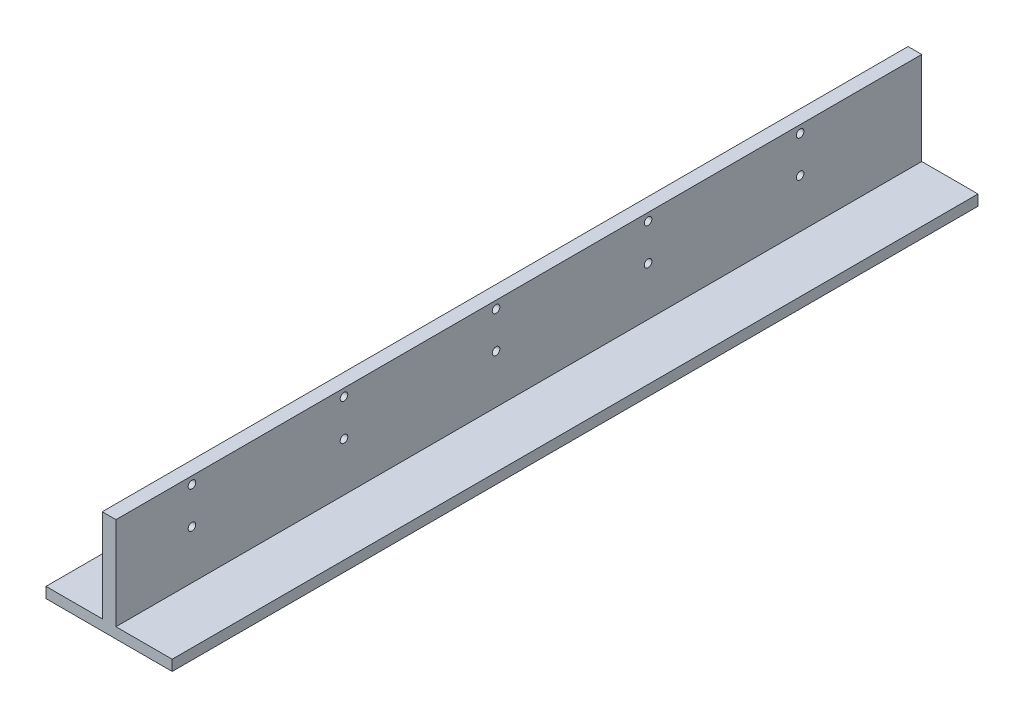
ISO-10303-21;
HEADER;
FILE_DESCRIPTION(('STEP AP214'),'2;1');
FILE_NAME('part.step','',(''),(''),'','','');
FILE_SCHEMA(('AUTOMOTIVE_DESIGN { 1 0 10303 214 1 1 1 1 }'));
ENDSEC;
DATA;
#1=APPLICATION_CONTEXT('core data for automotive mechanical design processes');
#2=APPLICATION_PROTOCOL_DEFINITION('international standard','automotive_design',2000,#1);
#3=PRODUCT_CONTEXT('',#1,'mechanical');
#4=PRODUCT('Part','Part','',(#3));
#5=PRODUCT_RELATED_PRODUCT_CATEGORY('part','',(#4));
#6=PRODUCT_DEFINITION_FORMATION('','',#4);
#7=PRODUCT_DEFINITION_CONTEXT('part definition',#1,'design');
#8=PRODUCT_DEFINITION('design','',#6,#7);
#9=PRODUCT_DEFINITION_SHAPE('','',#8);
#10=(LENGTH_UNIT() NAMED_UNIT(*) SI_UNIT(.MILLI.,.METRE.));
#11=(NAMED_UNIT(*) PLANE_ANGLE_UNIT() SI_UNIT($,.RADIAN.));
#12=(NAMED_UNIT(*) SI_UNIT($,.STERADIAN.) SOLID_ANGLE_UNIT());
#13=UNCERTAINTY_MEASURE_WITH_UNIT(LENGTH_MEASURE(1.E-05),#10,'distance_accuracy_value','');
#14=(GEOMETRIC_REPRESENTATION_CONTEXT(3) GLOBAL_UNCERTAINTY_ASSIGNED_CONTEXT((#13)) GLOBAL_UNIT_ASSIGNED_CONTEXT((#10,
#11,#12)) REPRESENTATION_CONTEXT('',''));
#15=CARTESIAN_POINT('',(0.,0.,0.));
#16=DIRECTION('',(0.,0.,1.));
#17=DIRECTION('',(1.,0.,0.));
#18=AXIS2_PLACEMENT_3D('',#15,#16,#17);
#19=CARTESIAN_POINT('',(0.,7.,530.));
#20=DIRECTION('',(1.,0.,0.));
#21=DIRECTION('',(0.,0.,-1.));
#22=AXIS2_PLACEMENT_3D('',#19,#20,#21);
#23=PLANE('',#22);
#24=DIRECTION('',(0.,-1.,0.));
#25=VECTOR('',#24,1.);
#26=CARTESIAN_POINT('',(0.,7.,0.));
#27=LINE('',#26,#25);
#28=CARTESIAN_POINT('',(0.,7.,0.));
#29=VERTEX_POINT('',#28);
#30=CARTESIAN_POINT('',(0.,0.,0.));
#31=VERTEX_POINT('',#30);
#32=EDGE_CURVE('E128',#29,#31,#27,.T.);
#33=ORIENTED_EDGE('',*,*,#32,.T.);
#34=DIRECTION('',(0.,0.,-1.));
#35=VECTOR('',#34,1.);
#36=CARTESIAN_POINT('',(0.,0.,530.));
#37=LINE('',#36,#35);
#38=CARTESIAN_POINT('',(0.,0.,530.));
#39=VERTEX_POINT('',#38);
#40=EDGE_CURVE('E11',#39,#31,#37,.T.);
#41=ORIENTED_EDGE('',*,*,#40,.F.);
#42=DIRECTION('',(0.,-1.,0.));
#43=VECTOR('',#42,1.);
#44=CARTESIAN_POINT('',(0.,7.,530.));
#45=LINE('',#44,#43);
#46=CARTESIAN_POINT('',(0.,7.,530.));
#47=VERTEX_POINT('',#46);
#48=EDGE_CURVE('E143',#47,#39,#45,.T.);
#49=ORIENTED_EDGE('',*,*,#48,.F.);
#50=DIRECTION('',(0.,0.,-1.));
#51=VECTOR('',#50,1.);
#52=CARTESIAN_POINT('',(0.,7.,530.));
#53=LINE('',#52,#51);
#54=EDGE_CURVE('E124',#47,#29,#53,.T.);
#55=ORIENTED_EDGE('',*,*,#54,.T.);
#56=EDGE_LOOP('',(#33,#41,#49,#55));
#57=FACE_BOUND('',#56,.T.);
#58=ADVANCED_FACE('F32',(#57),#23,.F.);
#59=CARTESIAN_POINT('',(0.,0.,530.));
#60=DIRECTION('',(0.,1.,0.));
#61=DIRECTION('',(0.,0.,1.));
#62=AXIS2_PLACEMENT_3D('',#59,#60,#61);
#63=PLANE('',#62);
#64=DIRECTION('',(1.,0.,0.));
#65=VECTOR('',#64,1.);
#66=CARTESIAN_POINT('',(0.,0.,0.));
#67=LINE('',#66,#65);
#68=CARTESIAN_POINT('',(83.,0.,0.));
#69=VERTEX_POINT('',#68);
#70=EDGE_CURVE('E131',#31,#69,#67,.T.);
#71=ORIENTED_EDGE('',*,*,#70,.T.);
#72=DIRECTION('',(0.,0.,-1.));
#73=VECTOR('',#72,1.);
#74=CARTESIAN_POINT('',(83.,0.,530.));
#75=LINE('',#74,#73);
#76=CARTESIAN_POINT('',(83.,0.,530.));
#77=VERTEX_POINT('',#76);
#78=EDGE_CURVE('E40',#77,#69,#75,.T.);
#79=ORIENTED_EDGE('',*,*,#78,.F.);
#80=DIRECTION('',(1.,0.,0.));
#81=VECTOR('',#80,1.);
#82=CARTESIAN_POINT('',(0.,0.,530.));
#83=LINE('',#82,#81);
#84=EDGE_CURVE('E91',#39,#77,#83,.T.);
#85=ORIENTED_EDGE('',*,*,#84,.F.);
#86=ORIENTED_EDGE('',*,*,#40,.T.);
#87=EDGE_LOOP('',(#71,#79,#85,#86));
#88=FACE_BOUND('',#87,.T.);
#89=ADVANCED_FACE('F283',(#88),#63,.F.);
#90=CARTESIAN_POINT('',(83.,0.,530.));
#91=DIRECTION('',(-1.,0.,0.));
#92=DIRECTION('',(0.,0.,1.));
#93=AXIS2_PLACEMENT_3D('',#90,#91,#92);
#94=PLANE('',#93);
#95=DIRECTION('',(0.,1.,0.));
#96=VECTOR('',#95,1.);
#97=CARTESIAN_POINT('',(83.,0.,0.));
#98=LINE('',#97,#96);
#99=CARTESIAN_POINT('',(83.,7.,0.));
#100=VERTEX_POINT('',#99);
#101=EDGE_CURVE('E134',#69,#100,#98,.T.);
#102=ORIENTED_EDGE('',*,*,#101,.T.);
#103=DIRECTION('',(0.,0.,-1.));
#104=VECTOR('',#103,1.);
#105=CARTESIAN_POINT('',(83.,7.,530.));
#106=LINE('',#105,#104);
#107=CARTESIAN_POINT('',(83.,7.,530.));
#108=VERTEX_POINT('',#107);
#109=EDGE_CURVE('E150',#108,#100,#106,.T.);
#110=ORIENTED_EDGE('',*,*,#109,.F.);
#111=DIRECTION('',(0.,1.,0.));
#112=VECTOR('',#111,1.);
#113=CARTESIAN_POINT('',(83.,0.,530.));
#114=LINE('',#113,#112);
#115=EDGE_CURVE('E158',#77,#108,#114,.T.);
#116=ORIENTED_EDGE('',*,*,#115,.F.);
#117=ORIENTED_EDGE('',*,*,#78,.T.);
#118=EDGE_LOOP('',(#102,#110,#116,#117));
#119=FACE_BOUND('',#118,.T.);
#120=ADVANCED_FACE('F156',(#119),#94,.F.);
#121=CARTESIAN_POINT('',(83.,7.,530.));
#122=DIRECTION('',(0.,-1.,0.));
#123=DIRECTION('',(0.,0.,-1.));
#124=AXIS2_PLACEMENT_3D('',#121,#122,#123);
#125=PLANE('',#124);
#126=DIRECTION('',(-1.,0.,0.));
#127=VECTOR('',#126,1.);
#128=CARTESIAN_POINT('',(83.,7.,0.));
#129=LINE('',#128,#127);
#130=CARTESIAN_POINT('',(46.,7.,0.));
#131=VERTEX_POINT('',#130);
#132=EDGE_CURVE('E136',#100,#131,#129,.T.);
#133=ORIENTED_EDGE('',*,*,#132,.T.);
#134=DIRECTION('',(0.,0.,-1.));
#135=VECTOR('',#134,1.);
#136=CARTESIAN_POINT('',(46.,7.,530.));
#137=LINE('',#136,#135);
#138=CARTESIAN_POINT('',(46.,7.,530.));
#139=VERTEX_POINT('',#138);
#140=EDGE_CURVE('E147',#139,#131,#137,.T.);
#141=ORIENTED_EDGE('',*,*,#140,.F.);
#142=DIRECTION('',(-1.,0.,0.));
#143=VECTOR('',#142,1.);
#144=CARTESIAN_POINT('',(83.,7.,530.));
#145=LINE('',#144,#143);
#146=EDGE_CURVE('E170',#108,#139,#145,.T.);
#147=ORIENTED_EDGE('',*,*,#146,.F.);
#148=ORIENTED_EDGE('',*,*,#109,.T.);
#149=EDGE_LOOP('',(#133,#141,#147,#148));
#150=FACE_BOUND('',#149,.T.);
#151=ADVANCED_FACE('F166',(#150),#125,.F.);
#152=CARTESIAN_POINT('',(46.,7.,530.));
#153=DIRECTION('',(-1.,0.,0.));
#154=DIRECTION('',(0.,0.,1.));
#155=AXIS2_PLACEMENT_3D('',#152,#153,#154);
#156=PLANE('',#155);
#157=CARTESIAN_POINT('',(46.,39.,480.));
#158=DIRECTION('',(-1.,0.,0.));
#159=DIRECTION('',(0.,1.,0.));
#160=AXIS2_PLACEMENT_3D('',#157,#158,#159);
#161=CIRCLE('',#160,2.50000000000002);
#162=CARTESIAN_POINT('',(46.,41.5,480.));
#163=VERTEX_POINT('',#162);
#164=EDGE_CURVE('E227',#163,#163,#161,.T.);
#165=ORIENTED_EDGE('',*,*,#164,.T.);
#166=EDGE_LOOP('',(#165));
#167=FACE_BOUND('',#166,.T.);
#168=CARTESIAN_POINT('',(46.,63.,480.));
#169=DIRECTION('',(-1.,0.,0.));
#170=DIRECTION('',(0.,-1.,0.));
#171=AXIS2_PLACEMENT_3D('',#168,#169,#170);
#172=CIRCLE('',#171,2.50000000000002);
#173=CARTESIAN_POINT('',(46.,60.5,480.));
#174=VERTEX_POINT('',#173);
#175=EDGE_CURVE('E221',#174,#174,#172,.T.);
#176=ORIENTED_EDGE('',*,*,#175,.T.);
#177=EDGE_LOOP('',(#176));
#178=FACE_BOUND('',#177,.T.);
#179=CARTESIAN_POINT('',(46.,39.,380.));
#180=DIRECTION('',(-1.,0.,0.));
#181=DIRECTION('',(0.,1.,0.));
#182=AXIS2_PLACEMENT_3D('',#179,#180,#181);
#183=CIRCLE('',#182,2.50000000000002);
#184=CARTESIAN_POINT('',(46.,41.5,380.));
#185=VERTEX_POINT('',#184);
#186=EDGE_CURVE('E215',#185,#185,#183,.T.);
#187=ORIENTED_EDGE('',*,*,#186,.T.);
#188=EDGE_LOOP('',(#187));
#189=FACE_BOUND('',#188,.T.);
#190=CARTESIAN_POINT('',(46.,63.,380.));
#191=DIRECTION('',(-1.,0.,0.));
#192=DIRECTION('',(0.,-1.,0.));
#193=AXIS2_PLACEMENT_3D('',#190,#191,#192);
#194=CIRCLE('',#193,2.50000000000002);
#195=CARTESIAN_POINT('',(46.,60.5,380.));
#196=VERTEX_POINT('',#195);
#197=EDGE_CURVE('E209',#196,#196,#194,.T.);
#198=ORIENTED_EDGE('',*,*,#197,.T.);
#199=EDGE_LOOP('',(#198));
#200=FACE_BOUND('',#199,.T.);
#201=CARTESIAN_POINT('',(46.,39.,280.));
#202=DIRECTION('',(-1.,0.,0.));
#203=DIRECTION('',(0.,1.,0.));
#204=AXIS2_PLACEMENT_3D('',#201,#202,#203);
#205=CIRCLE('',#204,2.50000000000002);
#206=CARTESIAN_POINT('',(46.,41.5,280.));
#207=VERTEX_POINT('',#206);
#208=EDGE_CURVE('E203',#207,#207,#205,.T.);
#209=ORIENTED_EDGE('',*,*,#208,.T.);
#210=EDGE_LOOP('',(#209));
#211=FACE_BOUND('',#210,.T.);
#212=CARTESIAN_POINT('',(46.,63.,280.));
#213=DIRECTION('',(-1.,0.,0.));
#214=DIRECTION('',(0.,-1.,0.));
#215=AXIS2_PLACEMENT_3D('',#212,#213,#214);
#216=CIRCLE('',#215,2.50000000000002);
#217=CARTESIAN_POINT('',(46.,60.5,280.));
#218=VERTEX_POINT('',#217);
#219=EDGE_CURVE('E197',#218,#218,#216,.T.);
#220=ORIENTED_EDGE('',*,*,#219,.T.);
#221=EDGE_LOOP('',(#220));
#222=FACE_BOUND('',#221,.T.);
#223=CARTESIAN_POINT('',(46.,39.,180.));
#224=DIRECTION('',(-1.,0.,0.));
#225=DIRECTION('',(0.,1.,0.));
#226=AXIS2_PLACEMENT_3D('',#223,#224,#225);
#227=CIRCLE('',#226,2.5);
#228=CARTESIAN_POINT('',(46.,41.5,180.));
#229=VERTEX_POINT('',#228);
#230=EDGE_CURVE('E191',#229,#229,#227,.T.);
#231=ORIENTED_EDGE('',*,*,#230,.T.);
#232=EDGE_LOOP('',(#231));
#233=FACE_BOUND('',#232,.T.);
#234=CARTESIAN_POINT('',(46.,63.,180.));
#235=DIRECTION('',(-1.,0.,0.));
#236=DIRECTION('',(0.,-1.,0.));
#237=AXIS2_PLACEMENT_3D('',#234,#235,#236);
#238=CIRCLE('',#237,2.5);
#239=CARTESIAN_POINT('',(46.,60.5,180.));
#240=VERTEX_POINT('',#239);
#241=EDGE_CURVE('E185',#240,#240,#238,.T.);
#242=ORIENTED_EDGE('',*,*,#241,.T.);
#243=EDGE_LOOP('',(#242));
#244=FACE_BOUND('',#243,.T.);
#245=CARTESIAN_POINT('',(46.,39.,80.));
#246=DIRECTION('',(-1.,0.,0.));
#247=DIRECTION('',(0.,1.,0.));
#248=AXIS2_PLACEMENT_3D('',#245,#246,#247);
#249=CIRCLE('',#248,2.50000000000001);
#250=CARTESIAN_POINT('',(46.,41.5,80.));
#251=VERTEX_POINT('',#250);
#252=EDGE_CURVE('E179',#251,#251,#249,.T.);
#253=ORIENTED_EDGE('',*,*,#252,.T.);
#254=EDGE_LOOP('',(#253));
#255=FACE_BOUND('',#254,.T.);
#256=CARTESIAN_POINT('',(46.,63.,80.));
#257=DIRECTION('',(-1.,0.,0.));
#258=DIRECTION('',(0.,-1.,0.));
#259=AXIS2_PLACEMENT_3D('',#256,#257,#258);
#260=CIRCLE('',#259,2.50000000000001);
#261=CARTESIAN_POINT('',(46.,60.5,80.));
#262=VERTEX_POINT('',#261);
#263=EDGE_CURVE('E132',#262,#262,#260,.T.);
#264=ORIENTED_EDGE('',*,*,#263,.T.);
#265=EDGE_LOOP('',(#264));
#266=FACE_BOUND('',#265,.T.);
#267=DIRECTION('',(0.,1.,0.));
#268=VECTOR('',#267,1.);
#269=CARTESIAN_POINT('',(46.,7.,0.));
#270=LINE('',#269,#268);
#271=CARTESIAN_POINT('',(46.,68.,0.));
#272=VERTEX_POINT('',#271);
#273=EDGE_CURVE('E138',#131,#272,#270,.T.);
#274=ORIENTED_EDGE('',*,*,#273,.T.);
#275=DIRECTION('',(0.,0.,-1.));
#276=VECTOR('',#275,1.);
#277=CARTESIAN_POINT('',(46.,68.,530.));
#278=LINE('',#277,#276);
#279=CARTESIAN_POINT('',(46.,68.,530.));
#280=VERTEX_POINT('',#279);
#281=EDGE_CURVE('E119',#280,#272,#278,.T.);
#282=ORIENTED_EDGE('',*,*,#281,.F.);
#283=DIRECTION('',(0.,1.,0.));
#284=VECTOR('',#283,1.);
#285=CARTESIAN_POINT('',(46.,7.,530.));
#286=LINE('',#285,#284);
#287=EDGE_CURVE('E110',#139,#280,#286,.T.);
#288=ORIENTED_EDGE('',*,*,#287,.F.);
#289=ORIENTED_EDGE('',*,*,#140,.T.);
#290=EDGE_LOOP('',(#274,#282,#288,#289));
#291=FACE_BOUND('',#290,.T.);
#292=ADVANCED_FACE('F169',(#167,#178,#189,#200,#211,#222,#233,#244,#255,#266,#291),#156,.F.);
#293=CARTESIAN_POINT('',(46.,68.,530.));
#294=DIRECTION('',(0.,-1.,0.));
#295=DIRECTION('',(0.,0.,-1.));
#296=AXIS2_PLACEMENT_3D('',#293,#294,#295);
#297=PLANE('',#296);
#298=DIRECTION('',(-1.,0.,0.));
#299=VECTOR('',#298,1.);
#300=CARTESIAN_POINT('',(46.,68.,0.));
#301=LINE('',#300,#299);
#302=CARTESIAN_POINT('',(37.,68.,0.));
#303=VERTEX_POINT('',#302);
#304=EDGE_CURVE('E118',#272,#303,#301,.T.);
#305=ORIENTED_EDGE('',*,*,#304,.T.);
#306=DIRECTION('',(0.,0.,-1.));
#307=VECTOR('',#306,1.);
#308=CARTESIAN_POINT('',(37.,68.,530.));
#309=LINE('',#308,#307);
#310=CARTESIAN_POINT('',(37.,68.,530.));
#311=VERTEX_POINT('',#310);
#312=EDGE_CURVE('E115',#311,#303,#309,.T.);
#313=ORIENTED_EDGE('',*,*,#312,.F.);
#314=DIRECTION('',(-1.,0.,0.));
#315=VECTOR('',#314,1.);
#316=CARTESIAN_POINT('',(46.,68.,530.));
#317=LINE('',#316,#315);
#318=EDGE_CURVE('E104',#280,#311,#317,.T.);
#319=ORIENTED_EDGE('',*,*,#318,.F.);
#320=ORIENTED_EDGE('',*,*,#281,.T.);
#321=EDGE_LOOP('',(#305,#313,#319,#320));
#322=FACE_BOUND('',#321,.T.);
#323=ADVANCED_FACE('F116',(#322),#297,.F.);
#324=CARTESIAN_POINT('',(37.,68.,530.));
#325=DIRECTION('',(1.,0.,0.));
#326=DIRECTION('',(0.,0.,-1.));
#327=AXIS2_PLACEMENT_3D('',#324,#325,#326);
#328=PLANE('',#327);
#329=CARTESIAN_POINT('',(37.,39.,480.));
#330=DIRECTION('',(-1.,0.,0.));
#331=DIRECTION('',(0.,1.,0.));
#332=AXIS2_PLACEMENT_3D('',#329,#330,#331);
#333=CIRCLE('',#332,2.50000000000002);
#334=CARTESIAN_POINT('',(37.,41.5,480.));
#335=VERTEX_POINT('',#334);
#336=EDGE_CURVE('E230',#335,#335,#333,.T.);
#337=ORIENTED_EDGE('',*,*,#336,.F.);
#338=EDGE_LOOP('',(#337));
#339=FACE_BOUND('',#338,.T.);
#340=CARTESIAN_POINT('',(37.,63.,480.));
#341=DIRECTION('',(-1.,0.,0.));
#342=DIRECTION('',(0.,-1.,0.));
#343=AXIS2_PLACEMENT_3D('',#340,#341,#342);
#344=CIRCLE('',#343,2.50000000000002);
#345=CARTESIAN_POINT('',(37.,60.5,480.));
#346=VERTEX_POINT('',#345);
#347=EDGE_CURVE('E224',#346,#346,#344,.T.);
#348=ORIENTED_EDGE('',*,*,#347,.F.);
#349=EDGE_LOOP('',(#348));
#350=FACE_BOUND('',#349,.T.);
#351=CARTESIAN_POINT('',(37.,39.,380.));
#352=DIRECTION('',(-1.,0.,0.));
#353=DIRECTION('',(0.,1.,0.));
#354=AXIS2_PLACEMENT_3D('',#351,#352,#353);
#355=CIRCLE('',#354,2.50000000000002);
#356=CARTESIAN_POINT('',(37.,41.5,380.));
#357=VERTEX_POINT('',#356);
#358=EDGE_CURVE('E218',#357,#357,#355,.T.);
#359=ORIENTED_EDGE('',*,*,#358,.F.);
#360=EDGE_LOOP('',(#359));
#361=FACE_BOUND('',#360,.T.);
#362=CARTESIAN_POINT('',(37.,63.,380.));
#363=DIRECTION('',(-1.,0.,0.));
#364=DIRECTION('',(0.,-1.,0.));
#365=AXIS2_PLACEMENT_3D('',#362,#363,#364);
#366=CIRCLE('',#365,2.50000000000002);
#367=CARTESIAN_POINT('',(37.,60.5,380.));
#368=VERTEX_POINT('',#367);
#369=EDGE_CURVE('E212',#368,#368,#366,.T.);
#370=ORIENTED_EDGE('',*,*,#369,.F.);
#371=EDGE_LOOP('',(#370));
#372=FACE_BOUND('',#371,.T.);
#373=CARTESIAN_POINT('',(37.,39.,280.));
#374=DIRECTION('',(-1.,0.,0.));
#375=DIRECTION('',(0.,1.,0.));
#376=AXIS2_PLACEMENT_3D('',#373,#374,#375);
#377=CIRCLE('',#376,2.50000000000002);
#378=CARTESIAN_POINT('',(37.,41.5,280.));
#379=VERTEX_POINT('',#378);
#380=EDGE_CURVE('E206',#379,#379,#377,.T.);
#381=ORIENTED_EDGE('',*,*,#380,.F.);
#382=EDGE_LOOP('',(#381));
#383=FACE_BOUND('',#382,.T.);
#384=CARTESIAN_POINT('',(37.,63.,280.));
#385=DIRECTION('',(-1.,0.,0.));
#386=DIRECTION('',(0.,-1.,0.));
#387=AXIS2_PLACEMENT_3D('',#384,#385,#386);
#388=CIRCLE('',#387,2.50000000000002);
#389=CARTESIAN_POINT('',(37.,60.5,280.));
#390=VERTEX_POINT('',#389);
#391=EDGE_CURVE('E200',#390,#390,#388,.T.);
#392=ORIENTED_EDGE('',*,*,#391,.F.);
#393=EDGE_LOOP('',(#392));
#394=FACE_BOUND('',#393,.T.);
#395=CARTESIAN_POINT('',(37.,39.,180.));
#396=DIRECTION('',(-1.,0.,0.));
#397=DIRECTION('',(0.,1.,0.));
#398=AXIS2_PLACEMENT_3D('',#395,#396,#397);
#399=CIRCLE('',#398,2.5);
#400=CARTESIAN_POINT('',(37.,41.5,180.));
#401=VERTEX_POINT('',#400);
#402=EDGE_CURVE('E194',#401,#401,#399,.T.);
#403=ORIENTED_EDGE('',*,*,#402,.F.);
#404=EDGE_LOOP('',(#403));
#405=FACE_BOUND('',#404,.T.);
#406=CARTESIAN_POINT('',(37.,63.,180.));
#407=DIRECTION('',(-1.,0.,0.));
#408=DIRECTION('',(0.,-1.,0.));
#409=AXIS2_PLACEMENT_3D('',#406,#407,#408);
#410=CIRCLE('',#409,2.5);
#411=CARTESIAN_POINT('',(37.,60.5,180.));
#412=VERTEX_POINT('',#411);
#413=EDGE_CURVE('E188',#412,#412,#410,.T.);
#414=ORIENTED_EDGE('',*,*,#413,.F.);
#415=EDGE_LOOP('',(#414));
#416=FACE_BOUND('',#415,.T.);
#417=CARTESIAN_POINT('',(37.,39.,80.));
#418=DIRECTION('',(-1.,0.,0.));
#419=DIRECTION('',(0.,1.,0.));
#420=AXIS2_PLACEMENT_3D('',#417,#418,#419);
#421=CIRCLE('',#420,2.50000000000001);
#422=CARTESIAN_POINT('',(37.,41.5,80.));
#423=VERTEX_POINT('',#422);
#424=EDGE_CURVE('E182',#423,#423,#421,.T.);
#425=ORIENTED_EDGE('',*,*,#424,.F.);
#426=EDGE_LOOP('',(#425));
#427=FACE_BOUND('',#426,.T.);
#428=CARTESIAN_POINT('',(37.,63.,80.));
#429=DIRECTION('',(-1.,0.,0.));
#430=DIRECTION('',(0.,-1.,0.));
#431=AXIS2_PLACEMENT_3D('',#428,#429,#430);
#432=CIRCLE('',#431,2.50000000000001);
#433=CARTESIAN_POINT('',(37.,60.5,80.));
#434=VERTEX_POINT('',#433);
#435=EDGE_CURVE('E176',#434,#434,#432,.T.);
#436=ORIENTED_EDGE('',*,*,#435,.F.);
#437=EDGE_LOOP('',(#436));
#438=FACE_BOUND('',#437,.T.);
#439=DIRECTION('',(0.,-1.,0.));
#440=VECTOR('',#439,1.);
#441=CARTESIAN_POINT('',(37.,68.,0.));
#442=LINE('',#441,#440);
#443=CARTESIAN_POINT('',(37.,7.,0.));
#444=VERTEX_POINT('',#443);
#445=EDGE_CURVE('E77',#303,#444,#442,.T.);
#446=ORIENTED_EDGE('',*,*,#445,.T.);
#447=DIRECTION('',(0.,0.,-1.));
#448=VECTOR('',#447,1.);
#449=CARTESIAN_POINT('',(37.,7.,530.));
#450=LINE('',#449,#448);
#451=CARTESIAN_POINT('',(37.,7.,530.));
#452=VERTEX_POINT('',#451);
#453=EDGE_CURVE('E120',#452,#444,#450,.T.);
#454=ORIENTED_EDGE('',*,*,#453,.F.);
#455=DIRECTION('',(0.,-1.,0.));
#456=VECTOR('',#455,1.);
#457=CARTESIAN_POINT('',(37.,68.,530.));
#458=LINE('',#457,#456);
#459=EDGE_CURVE('E108',#311,#452,#458,.T.);
#460=ORIENTED_EDGE('',*,*,#459,.F.);
#461=ORIENTED_EDGE('',*,*,#312,.T.);
#462=EDGE_LOOP('',(#446,#454,#460,#461));
#463=FACE_BOUND('',#462,.T.);
#464=ADVANCED_FACE('F122',(#339,#350,#361,#372,#383,#394,#405,#416,#427,#438,#463),#328,.F.);
#465=CARTESIAN_POINT('',(37.,7.,530.));
#466=DIRECTION('',(0.,-1.,0.));
#467=DIRECTION('',(1.,0.,0.));
#468=AXIS2_PLACEMENT_3D('',#465,#466,#467);
#469=PLANE('',#468);
#470=DIRECTION('',(-1.,0.,0.));
#471=VECTOR('',#470,1.);
#472=CARTESIAN_POINT('',(37.,7.,0.));
#473=LINE('',#472,#471);
#474=EDGE_CURVE('E83',#444,#29,#473,.T.);
#475=ORIENTED_EDGE('',*,*,#474,.T.);
#476=ORIENTED_EDGE('',*,*,#54,.F.);
#477=DIRECTION('',(-1.,0.,0.));
#478=VECTOR('',#477,1.);
#479=CARTESIAN_POINT('',(37.,7.,530.));
#480=LINE('',#479,#478);
#481=EDGE_CURVE('E48',#452,#47,#480,.T.);
#482=ORIENTED_EDGE('',*,*,#481,.F.);
#483=ORIENTED_EDGE('',*,*,#453,.T.);
#484=EDGE_LOOP('',(#475,#476,#482,#483));
#485=FACE_BOUND('',#484,.T.);
#486=ADVANCED_FACE('F247',(#485),#469,.F.);
#487=CARTESIAN_POINT('',(0.,0.,530.));
#488=DIRECTION('',(0.,0.,1.));
#489=DIRECTION('',(1.,0.,0.));
#490=AXIS2_PLACEMENT_3D('',#487,#488,#489);
#491=PLANE('',#490);
#492=ORIENTED_EDGE('',*,*,#48,.T.);
#493=ORIENTED_EDGE('',*,*,#84,.T.);
#494=ORIENTED_EDGE('',*,*,#115,.T.);
#495=ORIENTED_EDGE('',*,*,#146,.T.);
#496=ORIENTED_EDGE('',*,*,#287,.T.);
#497=ORIENTED_EDGE('',*,*,#318,.T.);
#498=ORIENTED_EDGE('',*,*,#459,.T.);
#499=ORIENTED_EDGE('',*,*,#481,.T.);
#500=EDGE_LOOP('',(#492,#493,#494,#495,#496,#497,#498,#499));
#501=FACE_BOUND('',#500,.T.);
#502=ADVANCED_FACE('F106',(#501),#491,.T.);
#503=CARTESIAN_POINT('',(0.,0.,0.));
#504=DIRECTION('',(0.,0.,1.));
#505=DIRECTION('',(1.,0.,0.));
#506=AXIS2_PLACEMENT_3D('',#503,#504,#505);
#507=PLANE('',#506);
#508=ORIENTED_EDGE('',*,*,#32,.F.);
#509=ORIENTED_EDGE('',*,*,#474,.F.);
#510=ORIENTED_EDGE('',*,*,#445,.F.);
#511=ORIENTED_EDGE('',*,*,#304,.F.);
#512=ORIENTED_EDGE('',*,*,#273,.F.);
#513=ORIENTED_EDGE('',*,*,#132,.F.);
#514=ORIENTED_EDGE('',*,*,#101,.F.);
#515=ORIENTED_EDGE('',*,*,#70,.F.);
#516=EDGE_LOOP('',(#508,#509,#510,#511,#512,#513,#514,#515));
#517=FACE_BOUND('',#516,.T.);
#518=ADVANCED_FACE('F162',(#517),#507,.F.);
#519=CARTESIAN_POINT('',(46.,63.,80.));
#520=DIRECTION('',(-1.,0.,0.));
#521=DIRECTION('',(0.,-1.,0.));
#522=AXIS2_PLACEMENT_3D('',#519,#520,#521);
#523=CYLINDRICAL_SURFACE('',#522,2.50000000000001);
#524=ORIENTED_EDGE('',*,*,#263,.F.);
#525=EDGE_LOOP('',(#524));
#526=FACE_BOUND('',#525,.T.);
#527=ORIENTED_EDGE('',*,*,#435,.T.);
#528=EDGE_LOOP('',(#527));
#529=FACE_BOUND('',#528,.T.);
#530=ADVANCED_FACE('F267',(#526,#529),#523,.F.);
#531=CARTESIAN_POINT('',(46.,39.,80.));
#532=DIRECTION('',(-1.,0.,0.));
#533=DIRECTION('',(0.,-1.,0.));
#534=AXIS2_PLACEMENT_3D('',#531,#532,#533);
#535=CYLINDRICAL_SURFACE('',#534,2.50000000000001);
#536=ORIENTED_EDGE('',*,*,#252,.F.);
#537=EDGE_LOOP('',(#536));
#538=FACE_BOUND('',#537,.T.);
#539=ORIENTED_EDGE('',*,*,#424,.T.);
#540=EDGE_LOOP('',(#539));
#541=FACE_BOUND('',#540,.T.);
#542=ADVANCED_FACE('F269',(#538,#541),#535,.F.);
#543=CARTESIAN_POINT('',(46.,63.,180.));
#544=DIRECTION('',(-1.,0.,0.));
#545=DIRECTION('',(0.,-1.,0.));
#546=AXIS2_PLACEMENT_3D('',#543,#544,#545);
#547=CYLINDRICAL_SURFACE('',#546,2.5);
#548=ORIENTED_EDGE('',*,*,#241,.F.);
#549=EDGE_LOOP('',(#548));
#550=FACE_BOUND('',#549,.T.);
#551=ORIENTED_EDGE('',*,*,#413,.T.);
#552=EDGE_LOOP('',(#551));
#553=FACE_BOUND('',#552,.T.);
#554=ADVANCED_FACE('F276',(#550,#553),#547,.F.);
#555=CARTESIAN_POINT('',(46.,39.,180.));
#556=DIRECTION('',(-1.,0.,0.));
#557=DIRECTION('',(0.,-1.,0.));
#558=AXIS2_PLACEMENT_3D('',#555,#556,#557);
#559=CYLINDRICAL_SURFACE('',#558,2.5);
#560=ORIENTED_EDGE('',*,*,#230,.F.);
#561=EDGE_LOOP('',(#560));
#562=FACE_BOUND('',#561,.T.);
#563=ORIENTED_EDGE('',*,*,#402,.T.);
#564=EDGE_LOOP('',(#563));
#565=FACE_BOUND('',#564,.T.);
#566=ADVANCED_FACE('F345',(#562,#565),#559,.F.);
#567=CARTESIAN_POINT('',(46.,63.,280.));
#568=DIRECTION('',(-1.,0.,0.));
#569=DIRECTION('',(0.,-1.,0.));
#570=AXIS2_PLACEMENT_3D('',#567,#568,#569);
#571=CYLINDRICAL_SURFACE('',#570,2.50000000000002);
#572=ORIENTED_EDGE('',*,*,#219,.F.);
#573=EDGE_LOOP('',(#572));
#574=FACE_BOUND('',#573,.T.);
#575=ORIENTED_EDGE('',*,*,#391,.T.);
#576=EDGE_LOOP('',(#575));
#577=FACE_BOUND('',#576,.T.);
#578=ADVANCED_FACE('F355',(#574,#577),#571,.F.);
#579=CARTESIAN_POINT('',(46.,39.,280.));
#580=DIRECTION('',(-1.,0.,0.));
#581=DIRECTION('',(0.,-1.,0.));
#582=AXIS2_PLACEMENT_3D('',#579,#580,#581);
#583=CYLINDRICAL_SURFACE('',#582,2.50000000000002);
#584=ORIENTED_EDGE('',*,*,#208,.F.);
#585=EDGE_LOOP('',(#584));
#586=FACE_BOUND('',#585,.T.);
#587=ORIENTED_EDGE('',*,*,#380,.T.);
#588=EDGE_LOOP('',(#587));
#589=FACE_BOUND('',#588,.T.);
#590=ADVANCED_FACE('F365',(#586,#589),#583,.F.);
#591=CARTESIAN_POINT('',(46.,63.,380.));
#592=DIRECTION('',(-1.,0.,0.));
#593=DIRECTION('',(0.,-1.,0.));
#594=AXIS2_PLACEMENT_3D('',#591,#592,#593);
#595=CYLINDRICAL_SURFACE('',#594,2.50000000000002);
#596=ORIENTED_EDGE('',*,*,#197,.F.);
#597=EDGE_LOOP('',(#596));
#598=FACE_BOUND('',#597,.T.);
#599=ORIENTED_EDGE('',*,*,#369,.T.);
#600=EDGE_LOOP('',(#599));
#601=FACE_BOUND('',#600,.T.);
#602=ADVANCED_FACE('F375',(#598,#601),#595,.F.);
#603=CARTESIAN_POINT('',(46.,39.,380.));
#604=DIRECTION('',(-1.,0.,0.));
#605=DIRECTION('',(0.,-1.,0.));
#606=AXIS2_PLACEMENT_3D('',#603,#604,#605);
#607=CYLINDRICAL_SURFACE('',#606,2.50000000000002);
#608=ORIENTED_EDGE('',*,*,#186,.F.);
#609=EDGE_LOOP('',(#608));
#610=FACE_BOUND('',#609,.T.);
#611=ORIENTED_EDGE('',*,*,#358,.T.);
#612=EDGE_LOOP('',(#611));
#613=FACE_BOUND('',#612,.T.);
#614=ADVANCED_FACE('F385',(#610,#613),#607,.F.);
#615=CARTESIAN_POINT('',(46.,63.,480.));
#616=DIRECTION('',(-1.,0.,0.));
#617=DIRECTION('',(0.,-1.,0.));
#618=AXIS2_PLACEMENT_3D('',#615,#616,#617);
#619=CYLINDRICAL_SURFACE('',#618,2.50000000000002);
#620=ORIENTED_EDGE('',*,*,#175,.F.);
#621=EDGE_LOOP('',(#620));
#622=FACE_BOUND('',#621,.T.);
#623=ORIENTED_EDGE('',*,*,#347,.T.);
#624=EDGE_LOOP('',(#623));
#625=FACE_BOUND('',#624,.T.);
#626=ADVANCED_FACE('F241',(#622,#625),#619,.F.);
#627=CARTESIAN_POINT('',(46.,39.,480.));
#628=DIRECTION('',(-1.,0.,0.));
#629=DIRECTION('',(0.,-1.,0.));
#630=AXIS2_PLACEMENT_3D('',#627,#628,#629);
#631=CYLINDRICAL_SURFACE('',#630,2.50000000000002);
#632=ORIENTED_EDGE('',*,*,#164,.F.);
#633=EDGE_LOOP('',(#632));
#634=FACE_BOUND('',#633,.T.);
#635=ORIENTED_EDGE('',*,*,#336,.T.);
#636=EDGE_LOOP('',(#635));
#637=FACE_BOUND('',#636,.T.);
#638=ADVANCED_FACE('F238',(#634,#637),#631,.F.);
#639=CLOSED_SHELL('',(#58,#89,#120,#151,#292,#323,#464,#486,#502,#518,#530,#542,#554,#566,#578,
#590,#602,#614,#626,#638));
#640=MANIFOLD_SOLID_BREP('B2',#639);
#641=ADVANCED_BREP_SHAPE_REPRESENTATION('',(#18,#640),#14);
#642=SHAPE_DEFINITION_REPRESENTATION(#9,#641);
ENDSEC;
END-ISO-10303-21;
